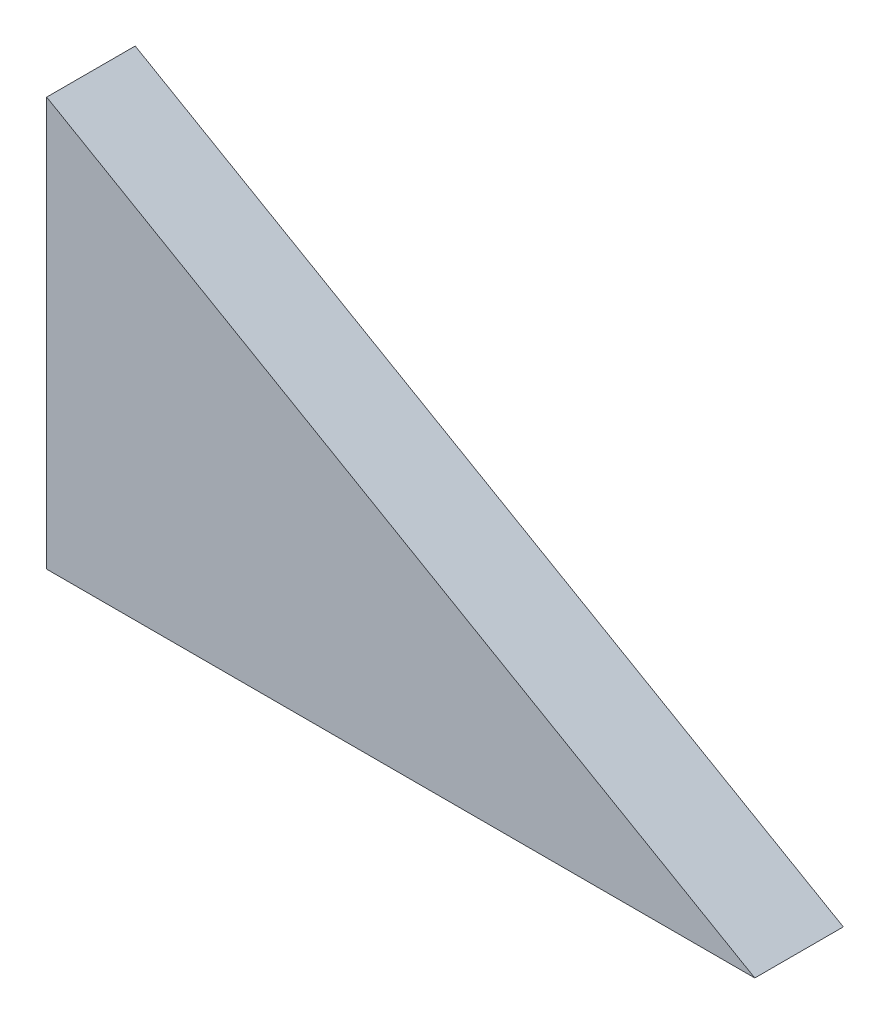
ISO-10303-21;
HEADER;
FILE_DESCRIPTION(('STEP AP214'),'2;1');
FILE_NAME('part.step','',(''),(''),'','','');
FILE_SCHEMA(('AUTOMOTIVE_DESIGN { 1 0 10303 214 1 1 1 1 }'));
ENDSEC;
DATA;
#1=APPLICATION_CONTEXT('core data for automotive mechanical design processes');
#2=APPLICATION_PROTOCOL_DEFINITION('international standard','automotive_design',2000,#1);
#3=PRODUCT_CONTEXT('',#1,'mechanical');
#4=PRODUCT('Part','Part','',(#3));
#5=PRODUCT_RELATED_PRODUCT_CATEGORY('part','',(#4));
#6=PRODUCT_DEFINITION_FORMATION('','',#4);
#7=PRODUCT_DEFINITION_CONTEXT('part definition',#1,'design');
#8=PRODUCT_DEFINITION('design','',#6,#7);
#9=PRODUCT_DEFINITION_SHAPE('','',#8);
#10=(LENGTH_UNIT() NAMED_UNIT(*) SI_UNIT(.MILLI.,.METRE.));
#11=(NAMED_UNIT(*) PLANE_ANGLE_UNIT() SI_UNIT($,.RADIAN.));
#12=(NAMED_UNIT(*) SI_UNIT($,.STERADIAN.) SOLID_ANGLE_UNIT());
#13=UNCERTAINTY_MEASURE_WITH_UNIT(LENGTH_MEASURE(1.E-05),#10,'distance_accuracy_value','');
#14=(GEOMETRIC_REPRESENTATION_CONTEXT(3) GLOBAL_UNCERTAINTY_ASSIGNED_CONTEXT((#13)) GLOBAL_UNIT_ASSIGNED_CONTEXT((#10,
#11,#12)) REPRESENTATION_CONTEXT('',''));
#15=CARTESIAN_POINT('',(0.,0.,0.));
#16=DIRECTION('',(0.,0.,1.));
#17=DIRECTION('',(1.,0.,0.));
#18=AXIS2_PLACEMENT_3D('',#15,#16,#17);
#19=CARTESIAN_POINT('',(-40.,23.094010767585,5.));
#20=DIRECTION('',(-0.5,-0.866025403784439,0.));
#21=DIRECTION('',(0.866025403784439,-0.5,0.));
#22=AXIS2_PLACEMENT_3D('',#19,#20,#21);
#23=PLANE('',#22);
#24=DIRECTION('',(-0.866025403784439,0.5,0.));
#25=VECTOR('',#24,1.);
#26=CARTESIAN_POINT('',(-40.,23.094010767585,0.));
#27=LINE('',#26,#25);
#28=CARTESIAN_POINT('',(0.,0.,0.));
#29=VERTEX_POINT('',#28);
#30=CARTESIAN_POINT('',(-40.,23.094010767585,0.));
#31=VERTEX_POINT('',#30);
#32=EDGE_CURVE('E80',#29,#31,#27,.T.);
#33=ORIENTED_EDGE('',*,*,#32,.T.);
#34=DIRECTION('',(0.,0.,-1.));
#35=VECTOR('',#34,1.);
#36=CARTESIAN_POINT('',(-40.,23.094010767585,5.));
#37=LINE('',#36,#35);
#38=CARTESIAN_POINT('',(-40.,23.094010767585,5.));
#39=VERTEX_POINT('',#38);
#40=EDGE_CURVE('E11',#39,#31,#37,.T.);
#41=ORIENTED_EDGE('',*,*,#40,.F.);
#42=DIRECTION('',(-0.866025403784439,0.5,0.));
#43=VECTOR('',#42,1.);
#44=CARTESIAN_POINT('',(-40.,23.094010767585,5.));
#45=LINE('',#44,#43);
#46=CARTESIAN_POINT('',(0.,0.,5.));
#47=VERTEX_POINT('',#46);
#48=EDGE_CURVE('E73',#47,#39,#45,.T.);
#49=ORIENTED_EDGE('',*,*,#48,.F.);
#50=DIRECTION('',(0.,0.,-1.));
#51=VECTOR('',#50,1.);
#52=CARTESIAN_POINT('',(0.,0.,5.));
#53=LINE('',#52,#51);
#54=EDGE_CURVE('E81',#47,#29,#53,.T.);
#55=ORIENTED_EDGE('',*,*,#54,.T.);
#56=EDGE_LOOP('',(#33,#41,#49,#55));
#57=FACE_BOUND('',#56,.T.);
#58=ADVANCED_FACE('F33',(#57),#23,.F.);
#59=CARTESIAN_POINT('',(-40.,0.,5.));
#60=DIRECTION('',(1.,0.,0.));
#61=DIRECTION('',(0.,0.,-1.));
#62=AXIS2_PLACEMENT_3D('',#59,#60,#61);
#63=PLANE('',#62);
#64=DIRECTION('',(0.,-1.,0.));
#65=VECTOR('',#64,1.);
#66=CARTESIAN_POINT('',(-40.,0.,0.));
#67=LINE('',#66,#65);
#68=CARTESIAN_POINT('',(-40.,0.,0.));
#69=VERTEX_POINT('',#68);
#70=EDGE_CURVE('E61',#31,#69,#67,.T.);
#71=ORIENTED_EDGE('',*,*,#70,.T.);
#72=DIRECTION('',(0.,0.,-1.));
#73=VECTOR('',#72,1.);
#74=CARTESIAN_POINT('',(-40.,0.,5.));
#75=LINE('',#74,#73);
#76=CARTESIAN_POINT('',(-40.,0.,5.));
#77=VERTEX_POINT('',#76);
#78=EDGE_CURVE('E41',#77,#69,#75,.T.);
#79=ORIENTED_EDGE('',*,*,#78,.F.);
#80=DIRECTION('',(0.,-1.,0.));
#81=VECTOR('',#80,1.);
#82=CARTESIAN_POINT('',(-40.,0.,5.));
#83=LINE('',#82,#81);
#84=EDGE_CURVE('E69',#39,#77,#83,.T.);
#85=ORIENTED_EDGE('',*,*,#84,.F.);
#86=ORIENTED_EDGE('',*,*,#40,.T.);
#87=EDGE_LOOP('',(#71,#79,#85,#86));
#88=FACE_BOUND('',#87,.T.);
#89=ADVANCED_FACE('F70',(#88),#63,.F.);
#90=CARTESIAN_POINT('',(0.,0.,5.));
#91=DIRECTION('',(0.,1.,0.));
#92=DIRECTION('',(-1.,0.,0.));
#93=AXIS2_PLACEMENT_3D('',#90,#91,#92);
#94=PLANE('',#93);
#95=DIRECTION('',(1.,0.,0.));
#96=VECTOR('',#95,1.);
#97=CARTESIAN_POINT('',(0.,0.,0.));
#98=LINE('',#97,#96);
#99=EDGE_CURVE('E66',#69,#29,#98,.T.);
#100=ORIENTED_EDGE('',*,*,#99,.T.);
#101=ORIENTED_EDGE('',*,*,#54,.F.);
#102=DIRECTION('',(1.,0.,0.));
#103=VECTOR('',#102,1.);
#104=CARTESIAN_POINT('',(0.,0.,5.));
#105=LINE('',#104,#103);
#106=EDGE_CURVE('E49',#77,#47,#105,.T.);
#107=ORIENTED_EDGE('',*,*,#106,.F.);
#108=ORIENTED_EDGE('',*,*,#78,.T.);
#109=EDGE_LOOP('',(#100,#101,#107,#108));
#110=FACE_BOUND('',#109,.T.);
#111=ADVANCED_FACE('F88',(#110),#94,.F.);
#112=CARTESIAN_POINT('',(0.,0.,5.));
#113=DIRECTION('',(0.,0.,1.));
#114=DIRECTION('',(1.,0.,0.));
#115=AXIS2_PLACEMENT_3D('',#112,#113,#114);
#116=PLANE('',#115);
#117=ORIENTED_EDGE('',*,*,#48,.T.);
#118=ORIENTED_EDGE('',*,*,#84,.T.);
#119=ORIENTED_EDGE('',*,*,#106,.T.);
#120=EDGE_LOOP('',(#117,#118,#119));
#121=FACE_BOUND('',#120,.T.);
#122=ADVANCED_FACE('F76',(#121),#116,.T.);
#123=CARTESIAN_POINT('',(0.,0.,0.));
#124=DIRECTION('',(0.,0.,1.));
#125=DIRECTION('',(1.,0.,0.));
#126=AXIS2_PLACEMENT_3D('',#123,#124,#125);
#127=PLANE('',#126);
#128=ORIENTED_EDGE('',*,*,#32,.F.);
#129=ORIENTED_EDGE('',*,*,#99,.F.);
#130=ORIENTED_EDGE('',*,*,#70,.F.);
#131=EDGE_LOOP('',(#128,#129,#130));
#132=FACE_BOUND('',#131,.T.);
#133=ADVANCED_FACE('F89',(#132),#127,.F.);
#134=CLOSED_SHELL('',(#58,#89,#111,#122,#133));
#135=MANIFOLD_SOLID_BREP('B2',#134);
#136=ADVANCED_BREP_SHAPE_REPRESENTATION('',(#18,#135),#14);
#137=SHAPE_DEFINITION_REPRESENTATION(#9,#136);
ENDSEC;
END-ISO-10303-21;
